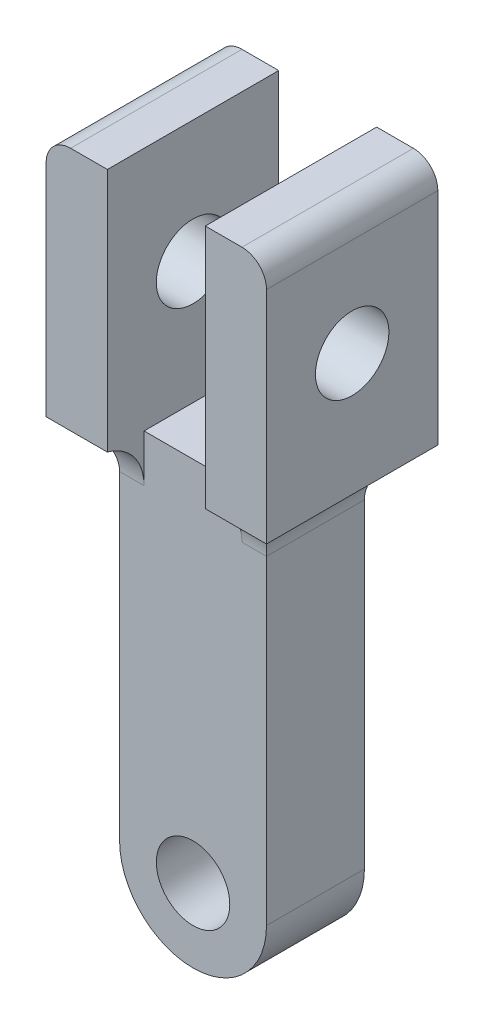
ISO-10303-21;
HEADER;
FILE_DESCRIPTION(('STEP AP214'),'2;1');
FILE_NAME('part.step','',(''),(''),'','','');
FILE_SCHEMA(('AUTOMOTIVE_DESIGN { 1 0 10303 214 1 1 1 1 }'));
ENDSEC;
DATA;
#1=APPLICATION_CONTEXT('core data for automotive mechanical design processes');
#2=APPLICATION_PROTOCOL_DEFINITION('international standard','automotive_design',2000,#1);
#3=PRODUCT_CONTEXT('',#1,'mechanical');
#4=PRODUCT('Part','Part','',(#3));
#5=PRODUCT_RELATED_PRODUCT_CATEGORY('part','',(#4));
#6=PRODUCT_DEFINITION_FORMATION('','',#4);
#7=PRODUCT_DEFINITION_CONTEXT('part definition',#1,'design');
#8=PRODUCT_DEFINITION('design','',#6,#7);
#9=PRODUCT_DEFINITION_SHAPE('','',#8);
#10=(LENGTH_UNIT() NAMED_UNIT(*) SI_UNIT(.MILLI.,.METRE.));
#11=(NAMED_UNIT(*) PLANE_ANGLE_UNIT() SI_UNIT($,.RADIAN.));
#12=(NAMED_UNIT(*) SI_UNIT($,.STERADIAN.) SOLID_ANGLE_UNIT());
#13=UNCERTAINTY_MEASURE_WITH_UNIT(LENGTH_MEASURE(1.E-05),#10,'distance_accuracy_value','');
#14=(GEOMETRIC_REPRESENTATION_CONTEXT(3) GLOBAL_UNCERTAINTY_ASSIGNED_CONTEXT((#13)) GLOBAL_UNIT_ASSIGNED_CONTEXT((#10,
#11,#12)) REPRESENTATION_CONTEXT('',''));
#15=CARTESIAN_POINT('',(0.,0.,0.));
#16=DIRECTION('',(0.,0.,1.));
#17=DIRECTION('',(1.,0.,0.));
#18=AXIS2_PLACEMENT_3D('',#15,#16,#17);
#19=CARTESIAN_POINT('',(-3.,15.,4.));
#20=DIRECTION('',(0.,-1.,0.));
#21=DIRECTION('',(0.,0.,-1.));
#22=AXIS2_PLACEMENT_3D('',#19,#20,#21);
#23=PLANE('',#22);
#24=DIRECTION('',(-1.,0.,0.));
#25=VECTOR('',#24,1.);
#26=CARTESIAN_POINT('',(-3.,15.,0.));
#27=LINE('',#26,#25);
#28=CARTESIAN_POINT('',(2.,15.,0.));
#29=VERTEX_POINT('',#28);
#30=CARTESIAN_POINT('',(-2.,15.,0.));
#31=VERTEX_POINT('',#30);
#32=EDGE_CURVE('E265',#29,#31,#27,.T.);
#33=ORIENTED_EDGE('',*,*,#32,.T.);
#34=DIRECTION('',(0.,0.,1.));
#35=VECTOR('',#34,1.);
#36=CARTESIAN_POINT('',(-2.,15.,5.5));
#37=LINE('',#36,#35);
#38=CARTESIAN_POINT('',(-2.,15.,4.));
#39=VERTEX_POINT('',#38);
#40=EDGE_CURVE('E206',#31,#39,#37,.T.);
#41=ORIENTED_EDGE('',*,*,#40,.T.);
#42=DIRECTION('',(-1.,0.,0.));
#43=VECTOR('',#42,1.);
#44=CARTESIAN_POINT('',(-3.,15.,4.));
#45=LINE('',#44,#43);
#46=CARTESIAN_POINT('',(2.,15.,4.));
#47=VERTEX_POINT('',#46);
#48=EDGE_CURVE('E269',#47,#39,#45,.T.);
#49=ORIENTED_EDGE('',*,*,#48,.F.);
#50=DIRECTION('',(0.,0.,1.));
#51=VECTOR('',#50,1.);
#52=CARTESIAN_POINT('',(2.,15.,5.5));
#53=LINE('',#52,#51);
#54=EDGE_CURVE('E238',#29,#47,#53,.T.);
#55=ORIENTED_EDGE('',*,*,#54,.F.);
#56=EDGE_LOOP('',(#33,#41,#49,#55));
#57=FACE_BOUND('',#56,.T.);
#58=ADVANCED_FACE('F39',(#57),#23,.F.);
#59=CARTESIAN_POINT('',(0.,0.,4.));
#60=DIRECTION('',(0.,0.,1.));
#61=DIRECTION('',(1.,0.,0.));
#62=AXIS2_PLACEMENT_3D('',#59,#60,#61);
#63=PLANE('',#62);
#64=DIRECTION('',(0.,1.,0.));
#65=VECTOR('',#64,1.);
#66=CARTESIAN_POINT('',(3.,0.,4.));
#67=LINE('',#66,#65);
#68=CARTESIAN_POINT('',(3.,0.,4.));
#69=VERTEX_POINT('',#68);
#70=CARTESIAN_POINT('',(3.,13.0635083268963,4.));
#71=VERTEX_POINT('',#70);
#72=EDGE_CURVE('E280',#69,#71,#67,.T.);
#73=ORIENTED_EDGE('',*,*,#72,.T.);
#74=DIRECTION('',(1.,0.,0.));
#75=VECTOR('',#74,1.);
#76=CARTESIAN_POINT('',(2.,13.0635083268963,4.));
#77=LINE('',#76,#75);
#78=CARTESIAN_POINT('',(2.,13.0635083268963,4.));
#79=VERTEX_POINT('',#78);
#80=EDGE_CURVE('E336',#71,#79,#77,.F.);
#81=ORIENTED_EDGE('',*,*,#80,.T.);
#82=DIRECTION('',(0.,1.,0.));
#83=VECTOR('',#82,1.);
#84=CARTESIAN_POINT('',(2.,0.,4.));
#85=LINE('',#84,#83);
#86=EDGE_CURVE('E326',#79,#47,#85,.T.);
#87=ORIENTED_EDGE('',*,*,#86,.T.);
#88=ORIENTED_EDGE('',*,*,#48,.T.);
#89=DIRECTION('',(0.,-1.,0.));
#90=VECTOR('',#89,1.);
#91=CARTESIAN_POINT('',(-2.,25.,4.));
#92=LINE('',#91,#90);
#93=CARTESIAN_POINT('',(-2.,13.0635083268963,4.));
#94=VERTEX_POINT('',#93);
#95=EDGE_CURVE('E242',#39,#94,#92,.T.);
#96=ORIENTED_EDGE('',*,*,#95,.T.);
#97=DIRECTION('',(-1.,0.,0.));
#98=VECTOR('',#97,1.);
#99=CARTESIAN_POINT('',(-3.,13.0635083268963,4.));
#100=LINE('',#99,#98);
#101=CARTESIAN_POINT('',(-3.,13.0635083268963,4.));
#102=VERTEX_POINT('',#101);
#103=EDGE_CURVE('E306',#94,#102,#100,.T.);
#104=ORIENTED_EDGE('',*,*,#103,.T.);
#105=DIRECTION('',(0.,-1.,0.));
#106=VECTOR('',#105,1.);
#107=CARTESIAN_POINT('',(-3.,0.,4.));
#108=LINE('',#107,#106);
#109=CARTESIAN_POINT('',(-3.,0.,4.));
#110=VERTEX_POINT('',#109);
#111=EDGE_CURVE('E273',#102,#110,#108,.T.);
#112=ORIENTED_EDGE('',*,*,#111,.T.);
#113=CARTESIAN_POINT('',(0.,0.,4.));
#114=DIRECTION('',(0.,0.,1.));
#115=DIRECTION('',(1.,0.,0.));
#116=AXIS2_PLACEMENT_3D('',#113,#114,#115);
#117=CIRCLE('',#116,3.);
#118=EDGE_CURVE('E277',#110,#69,#117,.T.);
#119=ORIENTED_EDGE('',*,*,#118,.T.);
#120=EDGE_LOOP('',(#73,#81,#87,#88,#96,#104,#112,#119));
#121=FACE_BOUND('',#120,.T.);
#122=CARTESIAN_POINT('',(0.,0.,4.));
#123=DIRECTION('',(0.,0.,1.));
#124=DIRECTION('',(1.,0.,0.));
#125=AXIS2_PLACEMENT_3D('',#122,#123,#124);
#126=CIRCLE('',#125,1.5);
#127=CARTESIAN_POINT('',(1.5,0.,4.));
#128=VERTEX_POINT('',#127);
#129=EDGE_CURVE('E261',#128,#128,#126,.T.);
#130=ORIENTED_EDGE('',*,*,#129,.F.);
#131=EDGE_LOOP('',(#130));
#132=FACE_BOUND('',#131,.T.);
#133=ADVANCED_FACE('F414',(#121,#132),#63,.T.);
#134=CARTESIAN_POINT('',(0.,0.,0.));
#135=DIRECTION('',(0.,0.,1.));
#136=DIRECTION('',(1.,0.,0.));
#137=AXIS2_PLACEMENT_3D('',#134,#135,#136);
#138=PLANE('',#137);
#139=ORIENTED_EDGE('',*,*,#32,.F.);
#140=DIRECTION('',(0.,-1.,0.));
#141=VECTOR('',#140,1.);
#142=CARTESIAN_POINT('',(2.,25.,0.));
#143=LINE('',#142,#141);
#144=CARTESIAN_POINT('',(2.,13.0635083268963,0.));
#145=VERTEX_POINT('',#144);
#146=EDGE_CURVE('E343',#29,#145,#143,.T.);
#147=ORIENTED_EDGE('',*,*,#146,.T.);
#148=DIRECTION('',(1.,0.,0.));
#149=VECTOR('',#148,1.);
#150=CARTESIAN_POINT('',(0.,13.0635083268963,0.));
#151=LINE('',#150,#149);
#152=CARTESIAN_POINT('',(3.,13.0635083268963,0.));
#153=VERTEX_POINT('',#152);
#154=EDGE_CURVE('E340',#145,#153,#151,.T.);
#155=ORIENTED_EDGE('',*,*,#154,.T.);
#156=DIRECTION('',(0.,1.,0.));
#157=VECTOR('',#156,1.);
#158=CARTESIAN_POINT('',(3.,0.,0.));
#159=LINE('',#158,#157);
#160=CARTESIAN_POINT('',(3.,0.,0.));
#161=VERTEX_POINT('',#160);
#162=EDGE_CURVE('E274',#161,#153,#159,.T.);
#163=ORIENTED_EDGE('',*,*,#162,.F.);
#164=CARTESIAN_POINT('',(0.,0.,0.));
#165=DIRECTION('',(0.,0.,1.));
#166=DIRECTION('',(1.,0.,0.));
#167=AXIS2_PLACEMENT_3D('',#164,#165,#166);
#168=CIRCLE('',#167,3.);
#169=CARTESIAN_POINT('',(-3.,0.,0.));
#170=VERTEX_POINT('',#169);
#171=EDGE_CURVE('E291',#170,#161,#168,.T.);
#172=ORIENTED_EDGE('',*,*,#171,.F.);
#173=DIRECTION('',(0.,-1.,0.));
#174=VECTOR('',#173,1.);
#175=CARTESIAN_POINT('',(-3.,0.,0.));
#176=LINE('',#175,#174);
#177=CARTESIAN_POINT('',(-3.,13.0635083268963,0.));
#178=VERTEX_POINT('',#177);
#179=EDGE_CURVE('E288',#178,#170,#176,.T.);
#180=ORIENTED_EDGE('',*,*,#179,.F.);
#181=DIRECTION('',(-1.,0.,0.));
#182=VECTOR('',#181,1.);
#183=CARTESIAN_POINT('',(0.,13.0635083268963,0.));
#184=LINE('',#183,#182);
#185=CARTESIAN_POINT('',(-2.,13.0635083268963,0.));
#186=VERTEX_POINT('',#185);
#187=EDGE_CURVE('E313',#178,#186,#184,.F.);
#188=ORIENTED_EDGE('',*,*,#187,.T.);
#189=DIRECTION('',(0.,1.,0.));
#190=VECTOR('',#189,1.);
#191=CARTESIAN_POINT('',(-2.,0.,0.));
#192=LINE('',#191,#190);
#193=EDGE_CURVE('E310',#186,#31,#192,.T.);
#194=ORIENTED_EDGE('',*,*,#193,.T.);
#195=EDGE_LOOP('',(#139,#147,#155,#163,#172,#180,#188,#194));
#196=FACE_BOUND('',#195,.T.);
#197=CARTESIAN_POINT('',(0.,0.,0.));
#198=DIRECTION('',(0.,0.,1.));
#199=DIRECTION('',(1.,0.,0.));
#200=AXIS2_PLACEMENT_3D('',#197,#198,#199);
#201=CIRCLE('',#200,1.5);
#202=CARTESIAN_POINT('',(1.5,0.,0.));
#203=VERTEX_POINT('',#202);
#204=EDGE_CURVE('E260',#203,#203,#201,.T.);
#205=ORIENTED_EDGE('',*,*,#204,.T.);
#206=EDGE_LOOP('',(#205));
#207=FACE_BOUND('',#206,.T.);
#208=ADVANCED_FACE('F420',(#196,#207),#138,.F.);
#209=CARTESIAN_POINT('',(-3.,0.,4.));
#210=DIRECTION('',(1.,0.,0.));
#211=DIRECTION('',(0.,0.,-1.));
#212=AXIS2_PLACEMENT_3D('',#209,#210,#211);
#213=PLANE('',#212);
#214=ORIENTED_EDGE('',*,*,#111,.F.);
#215=DIRECTION('',(0.,0.,1.));
#216=VECTOR('',#215,1.);
#217=CARTESIAN_POINT('',(-3.,13.0635083268963,4.));
#218=LINE('',#217,#216);
#219=EDGE_CURVE('E317',#102,#178,#218,.F.);
#220=ORIENTED_EDGE('',*,*,#219,.T.);
#221=ORIENTED_EDGE('',*,*,#179,.T.);
#222=DIRECTION('',(0.,0.,-1.));
#223=VECTOR('',#222,1.);
#224=CARTESIAN_POINT('',(-3.,0.,4.));
#225=LINE('',#224,#223);
#226=EDGE_CURVE('E243',#110,#170,#225,.T.);
#227=ORIENTED_EDGE('',*,*,#226,.F.);
#228=EDGE_LOOP('',(#214,#220,#221,#227));
#229=FACE_BOUND('',#228,.T.);
#230=ADVANCED_FACE('F425',(#229),#213,.F.);
#231=CARTESIAN_POINT('',(0.,0.,4.));
#232=DIRECTION('',(0.,0.,-1.));
#233=DIRECTION('',(-1.,0.,0.));
#234=AXIS2_PLACEMENT_3D('',#231,#232,#233);
#235=CYLINDRICAL_SURFACE('',#234,3.);
#236=ORIENTED_EDGE('',*,*,#171,.T.);
#237=DIRECTION('',(0.,0.,-1.));
#238=VECTOR('',#237,1.);
#239=CARTESIAN_POINT('',(3.,0.,4.));
#240=LINE('',#239,#238);
#241=EDGE_CURVE('E284',#69,#161,#240,.T.);
#242=ORIENTED_EDGE('',*,*,#241,.F.);
#243=ORIENTED_EDGE('',*,*,#118,.F.);
#244=ORIENTED_EDGE('',*,*,#226,.T.);
#245=EDGE_LOOP('',(#236,#242,#243,#244));
#246=FACE_BOUND('',#245,.T.);
#247=ADVANCED_FACE('F486',(#246),#235,.T.);
#248=CARTESIAN_POINT('',(3.,0.,4.));
#249=DIRECTION('',(-1.,0.,0.));
#250=DIRECTION('',(0.,0.,1.));
#251=AXIS2_PLACEMENT_3D('',#248,#249,#250);
#252=PLANE('',#251);
#253=ORIENTED_EDGE('',*,*,#162,.T.);
#254=DIRECTION('',(0.,0.,1.));
#255=VECTOR('',#254,1.);
#256=CARTESIAN_POINT('',(3.,13.0635083268963,4.));
#257=LINE('',#256,#255);
#258=EDGE_CURVE('E347',#153,#71,#257,.T.);
#259=ORIENTED_EDGE('',*,*,#258,.T.);
#260=ORIENTED_EDGE('',*,*,#72,.F.);
#261=ORIENTED_EDGE('',*,*,#241,.T.);
#262=EDGE_LOOP('',(#253,#259,#260,#261));
#263=FACE_BOUND('',#262,.T.);
#264=ADVANCED_FACE('F477',(#263),#252,.F.);
#265=CARTESIAN_POINT('',(0.,0.,4.));
#266=DIRECTION('',(0.,0.,-1.));
#267=DIRECTION('',(-1.,0.,0.));
#268=AXIS2_PLACEMENT_3D('',#265,#266,#267);
#269=CYLINDRICAL_SURFACE('',#268,1.5);
#270=ORIENTED_EDGE('',*,*,#129,.T.);
#271=EDGE_LOOP('',(#270));
#272=FACE_BOUND('',#271,.T.);
#273=ORIENTED_EDGE('',*,*,#204,.F.);
#274=EDGE_LOOP('',(#273));
#275=FACE_BOUND('',#274,.T.);
#276=ADVANCED_FACE('F469',(#272,#275),#269,.F.);
#277=CARTESIAN_POINT('',(4.5,25.,5.5));
#278=DIRECTION('',(-1.,0.,0.));
#279=DIRECTION('',(0.,0.,1.));
#280=AXIS2_PLACEMENT_3D('',#277,#278,#279);
#281=PLANE('',#280);
#282=CARTESIAN_POINT('',(4.5,20.,2.));
#283=DIRECTION('',(-1.,0.,0.));
#284=DIRECTION('',(0.,0.,1.));
#285=AXIS2_PLACEMENT_3D('',#282,#283,#284);
#286=CIRCLE('',#285,1.5);
#287=CARTESIAN_POINT('',(4.5,20.,3.5));
#288=VERTEX_POINT('',#287);
#289=EDGE_CURVE('E361',#288,#288,#286,.T.);
#290=ORIENTED_EDGE('',*,*,#289,.T.);
#291=EDGE_LOOP('',(#290));
#292=FACE_BOUND('',#291,.T.);
#293=DIRECTION('',(0.,-1.,0.));
#294=VECTOR('',#293,1.);
#295=CARTESIAN_POINT('',(4.5,25.,-1.5));
#296=LINE('',#295,#294);
#297=CARTESIAN_POINT('',(4.5,24.,-1.5));
#298=VERTEX_POINT('',#297);
#299=CARTESIAN_POINT('',(4.5,15.,-1.5));
#300=VERTEX_POINT('',#299);
#301=EDGE_CURVE('E257',#298,#300,#296,.T.);
#302=ORIENTED_EDGE('',*,*,#301,.F.);
#303=DIRECTION('',(0.,0.,-1.));
#304=VECTOR('',#303,1.);
#305=CARTESIAN_POINT('',(4.5,24.,5.5));
#306=LINE('',#305,#304);
#307=CARTESIAN_POINT('',(4.5,24.,5.5));
#308=VERTEX_POINT('',#307);
#309=EDGE_CURVE('E48',#298,#308,#306,.F.);
#310=ORIENTED_EDGE('',*,*,#309,.T.);
#311=DIRECTION('',(0.,-1.,0.));
#312=VECTOR('',#311,1.);
#313=CARTESIAN_POINT('',(4.5,25.,5.5));
#314=LINE('',#313,#312);
#315=CARTESIAN_POINT('',(4.5,15.,5.5));
#316=VERTEX_POINT('',#315);
#317=EDGE_CURVE('E231',#308,#316,#314,.T.);
#318=ORIENTED_EDGE('',*,*,#317,.T.);
#319=DIRECTION('',(0.,0.,-1.));
#320=VECTOR('',#319,1.);
#321=CARTESIAN_POINT('',(4.5,15.,5.5));
#322=LINE('',#321,#320);
#323=EDGE_CURVE('E219',#316,#300,#322,.T.);
#324=ORIENTED_EDGE('',*,*,#323,.T.);
#325=EDGE_LOOP('',(#302,#310,#318,#324));
#326=FACE_BOUND('',#325,.T.);
#327=ADVANCED_FACE('F467',(#292,#326),#281,.F.);
#328=CARTESIAN_POINT('',(4.5,25.,-1.5));
#329=DIRECTION('',(0.,0.,1.));
#330=DIRECTION('',(1.,0.,0.));
#331=AXIS2_PLACEMENT_3D('',#328,#329,#330);
#332=PLANE('',#331);
#333=DIRECTION('',(-1.,0.,0.));
#334=VECTOR('',#333,1.);
#335=CARTESIAN_POINT('',(4.5,25.,-1.5));
#336=LINE('',#335,#334);
#337=CARTESIAN_POINT('',(3.5,25.,-1.5));
#338=VERTEX_POINT('',#337);
#339=CARTESIAN_POINT('',(2.,25.,-1.5));
#340=VERTEX_POINT('',#339);
#341=EDGE_CURVE('E220',#338,#340,#336,.T.);
#342=ORIENTED_EDGE('',*,*,#341,.F.);
#343=CARTESIAN_POINT('',(3.5,24.,-1.5));
#344=DIRECTION('',(0.,0.,1.));
#345=DIRECTION('',(1.,0.,0.));
#346=AXIS2_PLACEMENT_3D('',#343,#344,#345);
#347=CIRCLE('',#346,1.);
#348=EDGE_CURVE('E62',#338,#298,#347,.F.);
#349=ORIENTED_EDGE('',*,*,#348,.T.);
#350=ORIENTED_EDGE('',*,*,#301,.T.);
#351=DIRECTION('',(-1.,0.,0.));
#352=VECTOR('',#351,1.);
#353=CARTESIAN_POINT('',(4.5,15.,-1.5));
#354=LINE('',#353,#352);
#355=CARTESIAN_POINT('',(2.,15.,-1.5));
#356=VERTEX_POINT('',#355);
#357=EDGE_CURVE('E235',#300,#356,#354,.T.);
#358=ORIENTED_EDGE('',*,*,#357,.T.);
#359=DIRECTION('',(0.,-1.,0.));
#360=VECTOR('',#359,1.);
#361=CARTESIAN_POINT('',(2.,25.,-1.5));
#362=LINE('',#361,#360);
#363=EDGE_CURVE('E253',#340,#356,#362,.T.);
#364=ORIENTED_EDGE('',*,*,#363,.F.);
#365=EDGE_LOOP('',(#342,#349,#350,#358,#364));
#366=FACE_BOUND('',#365,.T.);
#367=ADVANCED_FACE('F395',(#366),#332,.F.);
#368=CARTESIAN_POINT('',(2.,25.,5.5));
#369=DIRECTION('',(1.,0.,0.));
#370=DIRECTION('',(0.,0.,-1.));
#371=AXIS2_PLACEMENT_3D('',#368,#369,#370);
#372=PLANE('',#371);
#373=CARTESIAN_POINT('',(2.,20.,2.));
#374=DIRECTION('',(1.,0.,0.));
#375=DIRECTION('',(0.,0.,-1.));
#376=AXIS2_PLACEMENT_3D('',#373,#374,#375);
#377=CIRCLE('',#376,1.5);
#378=CARTESIAN_POINT('',(2.,20.,0.499999999999999));
#379=VERTEX_POINT('',#378);
#380=EDGE_CURVE('E369',#379,#379,#377,.T.);
#381=ORIENTED_EDGE('',*,*,#380,.T.);
#382=EDGE_LOOP('',(#381));
#383=FACE_BOUND('',#382,.T.);
#384=ORIENTED_EDGE('',*,*,#363,.T.);
#385=CARTESIAN_POINT('',(2.,13.0635083268963,-2.));
#386=DIRECTION('',(1.,0.,0.));
#387=DIRECTION('',(0.,0.,-1.));
#388=AXIS2_PLACEMENT_3D('',#385,#386,#387);
#389=CIRCLE('',#388,2.);
#390=EDGE_CURVE('E353',#356,#145,#389,.T.);
#391=ORIENTED_EDGE('',*,*,#390,.T.);
#392=ORIENTED_EDGE('',*,*,#146,.F.);
#393=ORIENTED_EDGE('',*,*,#54,.T.);
#394=ORIENTED_EDGE('',*,*,#86,.F.);
#395=CARTESIAN_POINT('',(2.,13.0635083268963,6.));
#396=DIRECTION('',(1.,0.,0.));
#397=DIRECTION('',(0.,0.,-1.));
#398=AXIS2_PLACEMENT_3D('',#395,#396,#397);
#399=CIRCLE('',#398,2.);
#400=CARTESIAN_POINT('',(2.,15.,5.5));
#401=VERTEX_POINT('',#400);
#402=EDGE_CURVE('E350',#79,#401,#399,.T.);
#403=ORIENTED_EDGE('',*,*,#402,.T.);
#404=DIRECTION('',(0.,-1.,0.));
#405=VECTOR('',#404,1.);
#406=CARTESIAN_POINT('',(2.,25.,5.5));
#407=LINE('',#406,#405);
#408=CARTESIAN_POINT('',(2.,25.,5.5));
#409=VERTEX_POINT('',#408);
#410=EDGE_CURVE('E249',#409,#401,#407,.T.);
#411=ORIENTED_EDGE('',*,*,#410,.F.);
#412=DIRECTION('',(0.,0.,1.));
#413=VECTOR('',#412,1.);
#414=CARTESIAN_POINT('',(2.,25.,5.5));
#415=LINE('',#414,#413);
#416=EDGE_CURVE('E223',#340,#409,#415,.T.);
#417=ORIENTED_EDGE('',*,*,#416,.F.);
#418=EDGE_LOOP('',(#384,#391,#392,#393,#394,#403,#411,#417));
#419=FACE_BOUND('',#418,.T.);
#420=ADVANCED_FACE('F401',(#383,#419),#372,.F.);
#421=CARTESIAN_POINT('',(4.5,25.,5.5));
#422=DIRECTION('',(0.,0.,-1.));
#423=DIRECTION('',(-1.,0.,0.));
#424=AXIS2_PLACEMENT_3D('',#421,#422,#423);
#425=PLANE('',#424);
#426=ORIENTED_EDGE('',*,*,#317,.F.);
#427=CARTESIAN_POINT('',(3.5,24.,5.5));
#428=DIRECTION('',(0.,0.,-1.));
#429=DIRECTION('',(-1.,0.,0.));
#430=AXIS2_PLACEMENT_3D('',#427,#428,#429);
#431=CIRCLE('',#430,1.);
#432=CARTESIAN_POINT('',(3.5,25.,5.5));
#433=VERTEX_POINT('',#432);
#434=EDGE_CURVE('E11',#308,#433,#431,.F.);
#435=ORIENTED_EDGE('',*,*,#434,.T.);
#436=DIRECTION('',(1.,0.,0.));
#437=VECTOR('',#436,1.);
#438=CARTESIAN_POINT('',(4.5,25.,5.5));
#439=LINE('',#438,#437);
#440=EDGE_CURVE('E227',#409,#433,#439,.T.);
#441=ORIENTED_EDGE('',*,*,#440,.F.);
#442=ORIENTED_EDGE('',*,*,#410,.T.);
#443=DIRECTION('',(1.,0.,0.));
#444=VECTOR('',#443,1.);
#445=CARTESIAN_POINT('',(4.5,15.,5.5));
#446=LINE('',#445,#444);
#447=EDGE_CURVE('E224',#401,#316,#446,.T.);
#448=ORIENTED_EDGE('',*,*,#447,.T.);
#449=EDGE_LOOP('',(#426,#435,#441,#442,#448));
#450=FACE_BOUND('',#449,.T.);
#451=ADVANCED_FACE('F405',(#450),#425,.F.);
#452=CARTESIAN_POINT('',(0.,25.,0.));
#453=DIRECTION('',(0.,1.,0.));
#454=DIRECTION('',(0.,0.,1.));
#455=AXIS2_PLACEMENT_3D('',#452,#453,#454);
#456=PLANE('',#455);
#457=ORIENTED_EDGE('',*,*,#440,.T.);
#458=DIRECTION('',(0.,0.,-1.));
#459=VECTOR('',#458,1.);
#460=CARTESIAN_POINT('',(3.5,25.,-1.5));
#461=LINE('',#460,#459);
#462=EDGE_CURVE('E382',#433,#338,#461,.T.);
#463=ORIENTED_EDGE('',*,*,#462,.T.);
#464=ORIENTED_EDGE('',*,*,#341,.T.);
#465=ORIENTED_EDGE('',*,*,#416,.T.);
#466=EDGE_LOOP('',(#457,#463,#464,#465));
#467=FACE_BOUND('',#466,.T.);
#468=ADVANCED_FACE('F390',(#467),#456,.T.);
#469=CARTESIAN_POINT('',(-4.5,25.,5.5));
#470=DIRECTION('',(-1.,0.,0.));
#471=DIRECTION('',(0.,0.,1.));
#472=AXIS2_PLACEMENT_3D('',#469,#470,#471);
#473=PLANE('',#472);
#474=CARTESIAN_POINT('',(-4.5,20.,2.));
#475=DIRECTION('',(-1.,0.,0.));
#476=DIRECTION('',(0.,0.,1.));
#477=AXIS2_PLACEMENT_3D('',#474,#475,#476);
#478=CIRCLE('',#477,1.5);
#479=CARTESIAN_POINT('',(-4.5,20.,3.5));
#480=VERTEX_POINT('',#479);
#481=EDGE_CURVE('E370',#480,#480,#478,.T.);
#482=ORIENTED_EDGE('',*,*,#481,.F.);
#483=EDGE_LOOP('',(#482));
#484=FACE_BOUND('',#483,.T.);
#485=DIRECTION('',(0.,-1.,0.));
#486=VECTOR('',#485,1.);
#487=CARTESIAN_POINT('',(-4.5,25.,5.5));
#488=LINE('',#487,#486);
#489=CARTESIAN_POINT('',(-4.5,24.,5.5));
#490=VERTEX_POINT('',#489);
#491=CARTESIAN_POINT('',(-4.5,15.,5.5));
#492=VERTEX_POINT('',#491);
#493=EDGE_CURVE('E174',#490,#492,#488,.T.);
#494=ORIENTED_EDGE('',*,*,#493,.F.);
#495=DIRECTION('',(0.,0.,-1.));
#496=VECTOR('',#495,1.);
#497=CARTESIAN_POINT('',(-4.5,24.,5.5));
#498=LINE('',#497,#496);
#499=CARTESIAN_POINT('',(-4.5,24.,-1.5));
#500=VERTEX_POINT('',#499);
#501=EDGE_CURVE('E356',#490,#500,#498,.T.);
#502=ORIENTED_EDGE('',*,*,#501,.T.);
#503=DIRECTION('',(0.,-1.,0.));
#504=VECTOR('',#503,1.);
#505=CARTESIAN_POINT('',(-4.5,25.,-1.5));
#506=LINE('',#505,#504);
#507=CARTESIAN_POINT('',(-4.5,15.,-1.5));
#508=VERTEX_POINT('',#507);
#509=EDGE_CURVE('E195',#500,#508,#506,.T.);
#510=ORIENTED_EDGE('',*,*,#509,.T.);
#511=DIRECTION('',(0.,0.,-1.));
#512=VECTOR('',#511,1.);
#513=CARTESIAN_POINT('',(-4.5,15.,5.5));
#514=LINE('',#513,#512);
#515=EDGE_CURVE('E199',#492,#508,#514,.T.);
#516=ORIENTED_EDGE('',*,*,#515,.F.);
#517=EDGE_LOOP('',(#494,#502,#510,#516));
#518=FACE_BOUND('',#517,.T.);
#519=ADVANCED_FACE('F507',(#484,#518),#473,.T.);
#520=CARTESIAN_POINT('',(-4.5,25.,5.5));
#521=DIRECTION('',(0.,0.,1.));
#522=DIRECTION('',(1.,0.,0.));
#523=AXIS2_PLACEMENT_3D('',#520,#521,#522);
#524=PLANE('',#523);
#525=DIRECTION('',(-1.,0.,0.));
#526=VECTOR('',#525,1.);
#527=CARTESIAN_POINT('',(-4.5,25.,5.5));
#528=LINE('',#527,#526);
#529=CARTESIAN_POINT('',(-2.,25.,5.5));
#530=VERTEX_POINT('',#529);
#531=CARTESIAN_POINT('',(-3.5,25.,5.5));
#532=VERTEX_POINT('',#531);
#533=EDGE_CURVE('E166',#530,#532,#528,.T.);
#534=ORIENTED_EDGE('',*,*,#533,.T.);
#535=CARTESIAN_POINT('',(-3.5,24.,5.5));
#536=DIRECTION('',(0.,0.,1.));
#537=DIRECTION('',(1.,0.,0.));
#538=AXIS2_PLACEMENT_3D('',#535,#536,#537);
#539=CIRCLE('',#538,1.);
#540=EDGE_CURVE('E379',#532,#490,#539,.T.);
#541=ORIENTED_EDGE('',*,*,#540,.T.);
#542=ORIENTED_EDGE('',*,*,#493,.T.);
#543=DIRECTION('',(-1.,0.,0.));
#544=VECTOR('',#543,1.);
#545=CARTESIAN_POINT('',(-4.5,15.,5.5));
#546=LINE('',#545,#544);
#547=CARTESIAN_POINT('',(-2.,15.,5.5));
#548=VERTEX_POINT('',#547);
#549=EDGE_CURVE('E169',#548,#492,#546,.T.);
#550=ORIENTED_EDGE('',*,*,#549,.F.);
#551=DIRECTION('',(0.,-1.,0.));
#552=VECTOR('',#551,1.);
#553=CARTESIAN_POINT('',(-2.,25.,5.5));
#554=LINE('',#553,#552);
#555=EDGE_CURVE('E163',#530,#548,#554,.T.);
#556=ORIENTED_EDGE('',*,*,#555,.F.);
#557=EDGE_LOOP('',(#534,#541,#542,#550,#556));
#558=FACE_BOUND('',#557,.T.);
#559=ADVANCED_FACE('F165',(#558),#524,.T.);
#560=CARTESIAN_POINT('',(-2.,25.,5.5));
#561=DIRECTION('',(1.,0.,0.));
#562=DIRECTION('',(0.,0.,-1.));
#563=AXIS2_PLACEMENT_3D('',#560,#561,#562);
#564=PLANE('',#563);
#565=CARTESIAN_POINT('',(-2.,20.,2.));
#566=DIRECTION('',(1.,0.,0.));
#567=DIRECTION('',(0.,0.,-1.));
#568=AXIS2_PLACEMENT_3D('',#565,#566,#567);
#569=CIRCLE('',#568,1.5);
#570=CARTESIAN_POINT('',(-2.,20.,0.499999999999999));
#571=VERTEX_POINT('',#570);
#572=EDGE_CURVE('E365',#571,#571,#569,.T.);
#573=ORIENTED_EDGE('',*,*,#572,.F.);
#574=EDGE_LOOP('',(#573));
#575=FACE_BOUND('',#574,.T.);
#576=ORIENTED_EDGE('',*,*,#40,.F.);
#577=ORIENTED_EDGE('',*,*,#193,.F.);
#578=CARTESIAN_POINT('',(-2.,13.0635083268963,-2.));
#579=DIRECTION('',(1.,0.,0.));
#580=DIRECTION('',(0.,0.,-1.));
#581=AXIS2_PLACEMENT_3D('',#578,#579,#580);
#582=CIRCLE('',#581,2.);
#583=CARTESIAN_POINT('',(-2.,15.,-1.5));
#584=VERTEX_POINT('',#583);
#585=EDGE_CURVE('E323',#186,#584,#582,.F.);
#586=ORIENTED_EDGE('',*,*,#585,.T.);
#587=DIRECTION('',(0.,-1.,0.));
#588=VECTOR('',#587,1.);
#589=CARTESIAN_POINT('',(-2.,25.,-1.5));
#590=LINE('',#589,#588);
#591=CARTESIAN_POINT('',(-2.,25.,-1.5));
#592=VERTEX_POINT('',#591);
#593=EDGE_CURVE('E175',#592,#584,#590,.T.);
#594=ORIENTED_EDGE('',*,*,#593,.F.);
#595=DIRECTION('',(0.,0.,1.));
#596=VECTOR('',#595,1.);
#597=CARTESIAN_POINT('',(-2.,25.,5.5));
#598=LINE('',#597,#596);
#599=EDGE_CURVE('E181',#592,#530,#598,.T.);
#600=ORIENTED_EDGE('',*,*,#599,.T.);
#601=ORIENTED_EDGE('',*,*,#555,.T.);
#602=CARTESIAN_POINT('',(-2.,13.0635083268963,6.));
#603=DIRECTION('',(1.,0.,0.));
#604=DIRECTION('',(0.,0.,-1.));
#605=AXIS2_PLACEMENT_3D('',#602,#603,#604);
#606=CIRCLE('',#605,2.);
#607=EDGE_CURVE('E320',#548,#94,#606,.F.);
#608=ORIENTED_EDGE('',*,*,#607,.T.);
#609=ORIENTED_EDGE('',*,*,#95,.F.);
#610=EDGE_LOOP('',(#576,#577,#586,#594,#600,#601,#608,#609));
#611=FACE_BOUND('',#610,.T.);
#612=ADVANCED_FACE('F189',(#575,#611),#564,.T.);
#613=CARTESIAN_POINT('',(-4.5,25.,-1.5));
#614=DIRECTION('',(0.,0.,-1.));
#615=DIRECTION('',(-1.,0.,0.));
#616=AXIS2_PLACEMENT_3D('',#613,#614,#615);
#617=PLANE('',#616);
#618=ORIENTED_EDGE('',*,*,#509,.F.);
#619=CARTESIAN_POINT('',(-3.5,24.,-1.5));
#620=DIRECTION('',(0.,0.,-1.));
#621=DIRECTION('',(-1.,0.,0.));
#622=AXIS2_PLACEMENT_3D('',#619,#620,#621);
#623=CIRCLE('',#622,1.);
#624=CARTESIAN_POINT('',(-3.5,25.,-1.5));
#625=VERTEX_POINT('',#624);
#626=EDGE_CURVE('E374',#500,#625,#623,.T.);
#627=ORIENTED_EDGE('',*,*,#626,.T.);
#628=DIRECTION('',(1.,0.,0.));
#629=VECTOR('',#628,1.);
#630=CARTESIAN_POINT('',(-4.5,25.,-1.5));
#631=LINE('',#630,#629);
#632=EDGE_CURVE('E192',#625,#592,#631,.T.);
#633=ORIENTED_EDGE('',*,*,#632,.T.);
#634=ORIENTED_EDGE('',*,*,#593,.T.);
#635=DIRECTION('',(1.,0.,0.));
#636=VECTOR('',#635,1.);
#637=CARTESIAN_POINT('',(-4.5,15.,-1.5));
#638=LINE('',#637,#636);
#639=EDGE_CURVE('E185',#508,#584,#638,.T.);
#640=ORIENTED_EDGE('',*,*,#639,.F.);
#641=EDGE_LOOP('',(#618,#627,#633,#634,#640));
#642=FACE_BOUND('',#641,.T.);
#643=ADVANCED_FACE('F514',(#642),#617,.T.);
#644=CARTESIAN_POINT('',(0.,25.,0.));
#645=DIRECTION('',(0.,1.,0.));
#646=DIRECTION('',(0.,0.,1.));
#647=AXIS2_PLACEMENT_3D('',#644,#645,#646);
#648=PLANE('',#647);
#649=ORIENTED_EDGE('',*,*,#632,.F.);
#650=DIRECTION('',(0.,0.,-1.));
#651=VECTOR('',#650,1.);
#652=CARTESIAN_POINT('',(-3.5,25.,0.));
#653=LINE('',#652,#651);
#654=EDGE_CURVE('E183',#625,#532,#653,.F.);
#655=ORIENTED_EDGE('',*,*,#654,.T.);
#656=ORIENTED_EDGE('',*,*,#533,.F.);
#657=ORIENTED_EDGE('',*,*,#599,.F.);
#658=EDGE_LOOP('',(#649,#655,#656,#657));
#659=FACE_BOUND('',#658,.T.);
#660=ADVANCED_FACE('F180',(#659),#648,.T.);
#661=CARTESIAN_POINT('',(0.,13.0635083268963,-2.));
#662=DIRECTION('',(-1.,0.,0.));
#663=DIRECTION('',(0.,0.,1.));
#664=AXIS2_PLACEMENT_3D('',#661,#662,#663);
#665=CYLINDRICAL_SURFACE('',#664,2.);
#666=ORIENTED_EDGE('',*,*,#585,.F.);
#667=ORIENTED_EDGE('',*,*,#187,.F.);
#668=CARTESIAN_POINT('',(-5.,13.0635083268963,-2.));
#669=DIRECTION('',(-0.707106781186548,0.,0.707106781186547));
#670=DIRECTION('',(0.707106781186547,0.,0.707106781186547));
#671=AXIS2_PLACEMENT_3D('',#668,#669,#670);
#672=ELLIPSE('',#671,2.82842712474619,2.);
#673=EDGE_CURVE('E203',#508,#178,#672,.F.);
#674=ORIENTED_EDGE('',*,*,#673,.F.);
#675=ORIENTED_EDGE('',*,*,#639,.T.);
#676=EDGE_LOOP('',(#666,#667,#674,#675));
#677=FACE_BOUND('',#676,.T.);
#678=ADVANCED_FACE('F435',(#677),#665,.F.);
#679=CARTESIAN_POINT('',(-5.,13.0635083268963,0.));
#680=DIRECTION('',(0.,0.,1.));
#681=DIRECTION('',(1.,0.,0.));
#682=AXIS2_PLACEMENT_3D('',#679,#680,#681);
#683=CYLINDRICAL_SURFACE('',#682,2.);
#684=ORIENTED_EDGE('',*,*,#673,.T.);
#685=ORIENTED_EDGE('',*,*,#219,.F.);
#686=CARTESIAN_POINT('',(-5.,13.0635083268963,6.));
#687=DIRECTION('',(0.707106781186547,0.,0.707106781186547));
#688=DIRECTION('',(0.707106781186547,0.,-0.707106781186547));
#689=AXIS2_PLACEMENT_3D('',#686,#687,#688);
#690=ELLIPSE('',#689,2.82842712474619,2.);
#691=EDGE_CURVE('E327',#492,#102,#690,.F.);
#692=ORIENTED_EDGE('',*,*,#691,.F.);
#693=ORIENTED_EDGE('',*,*,#515,.T.);
#694=EDGE_LOOP('',(#684,#685,#692,#693));
#695=FACE_BOUND('',#694,.T.);
#696=ADVANCED_FACE('F431',(#695),#683,.F.);
#697=CARTESIAN_POINT('',(0.,13.0635083268963,6.));
#698=DIRECTION('',(1.,0.,0.));
#699=DIRECTION('',(0.,0.,-1.));
#700=AXIS2_PLACEMENT_3D('',#697,#698,#699);
#701=CYLINDRICAL_SURFACE('',#700,2.);
#702=ORIENTED_EDGE('',*,*,#607,.F.);
#703=ORIENTED_EDGE('',*,*,#549,.T.);
#704=ORIENTED_EDGE('',*,*,#691,.T.);
#705=ORIENTED_EDGE('',*,*,#103,.F.);
#706=EDGE_LOOP('',(#702,#703,#704,#705));
#707=FACE_BOUND('',#706,.T.);
#708=ADVANCED_FACE('F427',(#707),#701,.F.);
#709=CARTESIAN_POINT('',(0.,13.0635083268963,-2.));
#710=DIRECTION('',(1.,0.,0.));
#711=DIRECTION('',(0.,0.,-1.));
#712=AXIS2_PLACEMENT_3D('',#709,#710,#711);
#713=CYLINDRICAL_SURFACE('',#712,2.);
#714=ORIENTED_EDGE('',*,*,#390,.F.);
#715=ORIENTED_EDGE('',*,*,#357,.F.);
#716=CARTESIAN_POINT('',(5.,13.0635083268963,-2.));
#717=DIRECTION('',(0.707106781186548,0.,0.707106781186547));
#718=DIRECTION('',(-0.707106781186547,0.,0.707106781186547));
#719=AXIS2_PLACEMENT_3D('',#716,#717,#718);
#720=ELLIPSE('',#719,2.82842712474619,2.);
#721=EDGE_CURVE('E330',#153,#300,#720,.F.);
#722=ORIENTED_EDGE('',*,*,#721,.F.);
#723=ORIENTED_EDGE('',*,*,#154,.F.);
#724=EDGE_LOOP('',(#714,#715,#722,#723));
#725=FACE_BOUND('',#724,.T.);
#726=ADVANCED_FACE('F430',(#725),#713,.F.);
#727=CARTESIAN_POINT('',(5.,13.0635083268963,0.));
#728=DIRECTION('',(0.,0.,1.));
#729=DIRECTION('',(1.,0.,0.));
#730=AXIS2_PLACEMENT_3D('',#727,#728,#729);
#731=CYLINDRICAL_SURFACE('',#730,2.);
#732=ORIENTED_EDGE('',*,*,#721,.T.);
#733=ORIENTED_EDGE('',*,*,#323,.F.);
#734=CARTESIAN_POINT('',(5.,13.0635083268963,6.));
#735=DIRECTION('',(-0.707106781186547,0.,0.707106781186547));
#736=DIRECTION('',(-0.707106781186547,0.,-0.707106781186547));
#737=AXIS2_PLACEMENT_3D('',#734,#735,#736);
#738=ELLIPSE('',#737,2.82842712474619,2.);
#739=EDGE_CURVE('E357',#71,#316,#738,.F.);
#740=ORIENTED_EDGE('',*,*,#739,.F.);
#741=ORIENTED_EDGE('',*,*,#258,.F.);
#742=EDGE_LOOP('',(#732,#733,#740,#741));
#743=FACE_BOUND('',#742,.T.);
#744=ADVANCED_FACE('F444',(#743),#731,.F.);
#745=CARTESIAN_POINT('',(0.,13.0635083268963,6.));
#746=DIRECTION('',(-1.,0.,0.));
#747=DIRECTION('',(0.,0.,1.));
#748=AXIS2_PLACEMENT_3D('',#745,#746,#747);
#749=CYLINDRICAL_SURFACE('',#748,2.);
#750=ORIENTED_EDGE('',*,*,#739,.T.);
#751=ORIENTED_EDGE('',*,*,#447,.F.);
#752=ORIENTED_EDGE('',*,*,#402,.F.);
#753=ORIENTED_EDGE('',*,*,#80,.F.);
#754=EDGE_LOOP('',(#750,#751,#752,#753));
#755=FACE_BOUND('',#754,.T.);
#756=ADVANCED_FACE('F440',(#755),#749,.F.);
#757=CARTESIAN_POINT('',(5.5,20.,2.));
#758=DIRECTION('',(-1.,0.,0.));
#759=DIRECTION('',(0.,0.,1.));
#760=AXIS2_PLACEMENT_3D('',#757,#758,#759);
#761=CYLINDRICAL_SURFACE('',#760,1.5);
#762=ORIENTED_EDGE('',*,*,#572,.T.);
#763=EDGE_LOOP('',(#762));
#764=FACE_BOUND('',#763,.T.);
#765=ORIENTED_EDGE('',*,*,#481,.T.);
#766=EDGE_LOOP('',(#765));
#767=FACE_BOUND('',#766,.T.);
#768=ADVANCED_FACE('F443',(#764,#767),#761,.F.);
#769=ORIENTED_EDGE('',*,*,#380,.F.);
#770=EDGE_LOOP('',(#769));
#771=FACE_BOUND('',#770,.T.);
#772=ORIENTED_EDGE('',*,*,#289,.F.);
#773=EDGE_LOOP('',(#772));
#774=FACE_BOUND('',#773,.T.);
#775=ADVANCED_FACE('F411',(#771,#774),#761,.F.);
#776=CARTESIAN_POINT('',(-3.5,24.,5.5));
#777=DIRECTION('',(0.,0.,-1.));
#778=DIRECTION('',(-1.,0.,0.));
#779=AXIS2_PLACEMENT_3D('',#776,#777,#778);
#780=CYLINDRICAL_SURFACE('',#779,1.);
#781=ORIENTED_EDGE('',*,*,#540,.F.);
#782=ORIENTED_EDGE('',*,*,#654,.F.);
#783=ORIENTED_EDGE('',*,*,#626,.F.);
#784=ORIENTED_EDGE('',*,*,#501,.F.);
#785=EDGE_LOOP('',(#781,#782,#783,#784));
#786=FACE_BOUND('',#785,.T.);
#787=ADVANCED_FACE('F407',(#786),#780,.T.);
#788=CARTESIAN_POINT('',(3.5,24.,0.));
#789=DIRECTION('',(0.,0.,1.));
#790=DIRECTION('',(1.,0.,0.));
#791=AXIS2_PLACEMENT_3D('',#788,#789,#790);
#792=CYLINDRICAL_SURFACE('',#791,1.);
#793=ORIENTED_EDGE('',*,*,#434,.F.);
#794=ORIENTED_EDGE('',*,*,#309,.F.);
#795=ORIENTED_EDGE('',*,*,#348,.F.);
#796=ORIENTED_EDGE('',*,*,#462,.F.);
#797=EDGE_LOOP('',(#793,#794,#795,#796));
#798=FACE_BOUND('',#797,.T.);
#799=ADVANCED_FACE('F41',(#798),#792,.T.);
#800=CLOSED_SHELL('',(#58,#133,#208,#230,#247,#264,#276,#327,#367,#420,#451,#468,#519,#559,#612,
#643,#660,#678,#696,#708,#726,#744,#756,#768,#775,#787,#799));
#801=MANIFOLD_SOLID_BREP('B2',#800);
#802=ADVANCED_BREP_SHAPE_REPRESENTATION('',(#18,#801),#14);
#803=SHAPE_DEFINITION_REPRESENTATION(#9,#802);
ENDSEC;
END-ISO-10303-21;
